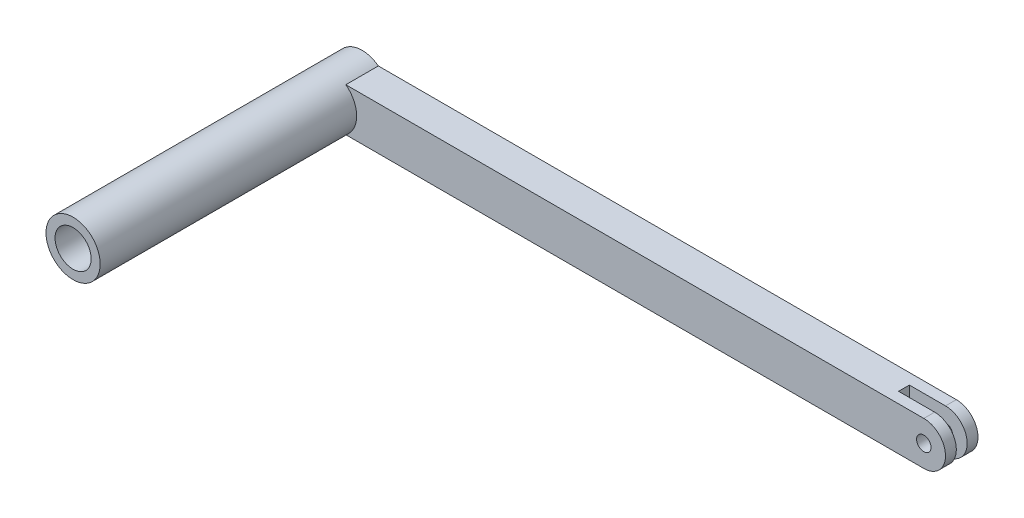
ISO-10303-21;
HEADER;
FILE_DESCRIPTION(('STEP AP214'),'2;1');
FILE_NAME('part.step','',(''),(''),'','','');
FILE_SCHEMA(('AUTOMOTIVE_DESIGN { 1 0 10303 214 1 1 1 1 }'));
ENDSEC;
DATA;
#1=APPLICATION_CONTEXT('core data for automotive mechanical design processes');
#2=APPLICATION_PROTOCOL_DEFINITION('international standard','automotive_design',2000,#1);
#3=PRODUCT_CONTEXT('',#1,'mechanical');
#4=PRODUCT('Part','Part','',(#3));
#5=PRODUCT_RELATED_PRODUCT_CATEGORY('part','',(#4));
#6=PRODUCT_DEFINITION_FORMATION('','',#4);
#7=PRODUCT_DEFINITION_CONTEXT('part definition',#1,'design');
#8=PRODUCT_DEFINITION('design','',#6,#7);
#9=PRODUCT_DEFINITION_SHAPE('','',#8);
#10=(LENGTH_UNIT() NAMED_UNIT(*) SI_UNIT(.MILLI.,.METRE.));
#11=(NAMED_UNIT(*) PLANE_ANGLE_UNIT() SI_UNIT($,.RADIAN.));
#12=(NAMED_UNIT(*) SI_UNIT($,.STERADIAN.) SOLID_ANGLE_UNIT());
#13=UNCERTAINTY_MEASURE_WITH_UNIT(LENGTH_MEASURE(1.E-05),#10,'distance_accuracy_value','');
#14=(GEOMETRIC_REPRESENTATION_CONTEXT(3) GLOBAL_UNCERTAINTY_ASSIGNED_CONTEXT((#13)) GLOBAL_UNIT_ASSIGNED_CONTEXT((#10,
#11,#12)) REPRESENTATION_CONTEXT('',''));
#15=CARTESIAN_POINT('',(0.,0.,0.));
#16=DIRECTION('',(0.,0.,1.));
#17=DIRECTION('',(1.,0.,0.));
#18=AXIS2_PLACEMENT_3D('',#15,#16,#17);
#19=CARTESIAN_POINT('',(164.5,0.,0.));
#20=DIRECTION('',(0.,0.,1.));
#21=DIRECTION('',(1.,0.,0.));
#22=AXIS2_PLACEMENT_3D('',#19,#20,#21);
#23=CYLINDRICAL_SURFACE('',#22,6.);
#24=CARTESIAN_POINT('',(164.5,0.,6.));
#25=DIRECTION('',(0.,0.,1.));
#26=DIRECTION('',(1.,0.,0.));
#27=AXIS2_PLACEMENT_3D('',#24,#25,#26);
#28=CIRCLE('',#27,6.);
#29=CARTESIAN_POINT('',(164.5,6.00000000000002,6.));
#30=VERTEX_POINT('',#29);
#31=CARTESIAN_POINT('',(164.5,-6.,6.));
#32=VERTEX_POINT('',#31);
#33=EDGE_CURVE('E145',#30,#32,#28,.F.);
#34=ORIENTED_EDGE('',*,*,#33,.F.);
#35=DIRECTION('',(0.,0.,1.));
#36=VECTOR('',#35,1.);
#37=CARTESIAN_POINT('',(164.5,6.,0.));
#38=LINE('',#37,#36);
#39=CARTESIAN_POINT('',(164.5,6.,9.));
#40=VERTEX_POINT('',#39);
#41=EDGE_CURVE('E187',#30,#40,#38,.T.);
#42=ORIENTED_EDGE('',*,*,#41,.T.);
#43=CARTESIAN_POINT('',(164.5,0.,9.));
#44=DIRECTION('',(0.,0.,1.));
#45=DIRECTION('',(-1.,0.,0.));
#46=AXIS2_PLACEMENT_3D('',#43,#44,#45);
#47=CIRCLE('',#46,6.);
#48=CARTESIAN_POINT('',(164.5,-6.,9.));
#49=VERTEX_POINT('',#48);
#50=EDGE_CURVE('E175',#49,#40,#47,.T.);
#51=ORIENTED_EDGE('',*,*,#50,.F.);
#52=DIRECTION('',(0.,0.,1.));
#53=VECTOR('',#52,1.);
#54=CARTESIAN_POINT('',(164.5,-6.,0.));
#55=LINE('',#54,#53);
#56=EDGE_CURVE('E192',#32,#49,#55,.T.);
#57=ORIENTED_EDGE('',*,*,#56,.F.);
#58=EDGE_LOOP('',(#34,#42,#51,#57));
#59=FACE_BOUND('',#58,.T.);
#60=ADVANCED_FACE('F39',(#59),#23,.T.);
#61=CARTESIAN_POINT('',(164.5,0.,0.));
#62=DIRECTION('',(0.,0.,1.));
#63=DIRECTION('',(1.,0.,0.));
#64=AXIS2_PLACEMENT_3D('',#61,#62,#63);
#65=CYLINDRICAL_SURFACE('',#64,2.);
#66=CARTESIAN_POINT('',(164.5,0.,6.));
#67=DIRECTION('',(0.,0.,1.));
#68=DIRECTION('',(1.,0.,0.));
#69=AXIS2_PLACEMENT_3D('',#66,#67,#68);
#70=CIRCLE('',#69,2.);
#71=CARTESIAN_POINT('',(166.5,0.,6.));
#72=VERTEX_POINT('',#71);
#73=EDGE_CURVE('E141',#72,#72,#70,.F.);
#74=ORIENTED_EDGE('',*,*,#73,.T.);
#75=EDGE_LOOP('',(#74));
#76=FACE_BOUND('',#75,.T.);
#77=CARTESIAN_POINT('',(164.5,0.,9.));
#78=DIRECTION('',(0.,0.,1.));
#79=DIRECTION('',(1.,0.,0.));
#80=AXIS2_PLACEMENT_3D('',#77,#78,#79);
#81=CIRCLE('',#80,2.);
#82=CARTESIAN_POINT('',(166.5,0.,9.));
#83=VERTEX_POINT('',#82);
#84=EDGE_CURVE('E148',#83,#83,#81,.T.);
#85=ORIENTED_EDGE('',*,*,#84,.T.);
#86=EDGE_LOOP('',(#85));
#87=FACE_BOUND('',#86,.T.);
#88=ADVANCED_FACE('F216',(#76,#87),#65,.F.);
#89=CARTESIAN_POINT('',(0.,0.,80.));
#90=DIRECTION('',(0.,0.,1.));
#91=DIRECTION('',(1.,0.,0.));
#92=AXIS2_PLACEMENT_3D('',#89,#90,#91);
#93=PLANE('',#92);
#94=CARTESIAN_POINT('',(0.,0.,80.));
#95=DIRECTION('',(0.,0.,1.));
#96=DIRECTION('',(1.,0.,0.));
#97=AXIS2_PLACEMENT_3D('',#94,#95,#96);
#98=CIRCLE('',#97,7.5);
#99=CARTESIAN_POINT('',(7.5,0.,80.));
#100=VERTEX_POINT('',#99);
#101=EDGE_CURVE('E48',#100,#100,#98,.T.);
#102=ORIENTED_EDGE('',*,*,#101,.T.);
#103=EDGE_LOOP('',(#102));
#104=FACE_BOUND('',#103,.T.);
#105=CARTESIAN_POINT('',(0.,0.,80.));
#106=DIRECTION('',(0.,0.,1.));
#107=DIRECTION('',(1.,0.,0.));
#108=AXIS2_PLACEMENT_3D('',#105,#106,#107);
#109=CIRCLE('',#108,5.);
#110=CARTESIAN_POINT('',(5.,0.,80.));
#111=VERTEX_POINT('',#110);
#112=EDGE_CURVE('E196',#111,#111,#109,.T.);
#113=ORIENTED_EDGE('',*,*,#112,.F.);
#114=EDGE_LOOP('',(#113));
#115=FACE_BOUND('',#114,.T.);
#116=ADVANCED_FACE('F240',(#104,#115),#93,.T.);
#117=CARTESIAN_POINT('',(0.,0.,0.));
#118=DIRECTION('',(0.,0.,1.));
#119=DIRECTION('',(1.,0.,0.));
#120=AXIS2_PLACEMENT_3D('',#117,#118,#119);
#121=PLANE('',#120);
#122=CARTESIAN_POINT('',(0.,0.,0.));
#123=DIRECTION('',(0.,0.,1.));
#124=DIRECTION('',(1.,0.,0.));
#125=AXIS2_PLACEMENT_3D('',#122,#123,#124);
#126=CIRCLE('',#125,7.5);
#127=CARTESIAN_POINT('',(4.50000000000003,6.,0.));
#128=VERTEX_POINT('',#127);
#129=CARTESIAN_POINT('',(4.50000000000003,-6.,0.));
#130=VERTEX_POINT('',#129);
#131=EDGE_CURVE('E200',#128,#130,#126,.T.);
#132=ORIENTED_EDGE('',*,*,#131,.F.);
#133=DIRECTION('',(-1.,0.,0.));
#134=VECTOR('',#133,1.);
#135=CARTESIAN_POINT('',(164.5,6.,0.));
#136=LINE('',#135,#134);
#137=CARTESIAN_POINT('',(164.5,6.,0.));
#138=VERTEX_POINT('',#137);
#139=EDGE_CURVE('E165',#138,#128,#136,.T.);
#140=ORIENTED_EDGE('',*,*,#139,.F.);
#141=CARTESIAN_POINT('',(164.5,0.,0.));
#142=DIRECTION('',(0.,0.,1.));
#143=DIRECTION('',(-1.,0.,0.));
#144=AXIS2_PLACEMENT_3D('',#141,#142,#143);
#145=CIRCLE('',#144,6.);
#146=CARTESIAN_POINT('',(164.5,-6.,0.));
#147=VERTEX_POINT('',#146);
#148=EDGE_CURVE('E161',#147,#138,#145,.T.);
#149=ORIENTED_EDGE('',*,*,#148,.F.);
#150=DIRECTION('',(1.,0.,0.));
#151=VECTOR('',#150,1.);
#152=CARTESIAN_POINT('',(164.5,-6.,0.));
#153=LINE('',#152,#151);
#154=EDGE_CURVE('E157',#130,#147,#153,.T.);
#155=ORIENTED_EDGE('',*,*,#154,.F.);
#156=EDGE_LOOP('',(#132,#140,#149,#155));
#157=FACE_BOUND('',#156,.T.);
#158=CARTESIAN_POINT('',(0.,0.,0.));
#159=DIRECTION('',(0.,0.,1.));
#160=DIRECTION('',(1.,0.,0.));
#161=AXIS2_PLACEMENT_3D('',#158,#159,#160);
#162=CIRCLE('',#161,5.);
#163=CARTESIAN_POINT('',(5.,0.,0.));
#164=VERTEX_POINT('',#163);
#165=EDGE_CURVE('E183',#164,#164,#162,.T.);
#166=ORIENTED_EDGE('',*,*,#165,.T.);
#167=EDGE_LOOP('',(#166));
#168=FACE_BOUND('',#167,.T.);
#169=CARTESIAN_POINT('',(164.5,0.,0.));
#170=DIRECTION('',(0.,0.,1.));
#171=DIRECTION('',(1.,0.,0.));
#172=AXIS2_PLACEMENT_3D('',#169,#170,#171);
#173=CIRCLE('',#172,2.);
#174=CARTESIAN_POINT('',(166.5,0.,0.));
#175=VERTEX_POINT('',#174);
#176=EDGE_CURVE('E149',#175,#175,#173,.T.);
#177=ORIENTED_EDGE('',*,*,#176,.T.);
#178=EDGE_LOOP('',(#177));
#179=FACE_BOUND('',#178,.T.);
#180=ADVANCED_FACE('F258',(#157,#168,#179),#121,.F.);
#181=CARTESIAN_POINT('',(0.,0.,80.));
#182=DIRECTION('',(0.,0.,-1.));
#183=DIRECTION('',(-1.,0.,0.));
#184=AXIS2_PLACEMENT_3D('',#181,#182,#183);
#185=CYLINDRICAL_SURFACE('',#184,7.5);
#186=ORIENTED_EDGE('',*,*,#101,.F.);
#187=EDGE_LOOP('',(#186));
#188=FACE_BOUND('',#187,.T.);
#189=CARTESIAN_POINT('',(0.,0.,9.));
#190=DIRECTION('',(0.,0.,-1.));
#191=DIRECTION('',(1.,0.,0.));
#192=AXIS2_PLACEMENT_3D('',#189,#190,#191);
#193=CIRCLE('',#192,7.50000000000002);
#194=CARTESIAN_POINT('',(4.50000000000002,5.99999999999999,8.99999999999999));
#195=VERTEX_POINT('',#194);
#196=CARTESIAN_POINT('',(4.50000000000003,-6.,9.));
#197=VERTEX_POINT('',#196);
#198=EDGE_CURVE('E153',#195,#197,#193,.T.);
#199=ORIENTED_EDGE('',*,*,#198,.F.);
#200=DIRECTION('',(0.,0.,1.));
#201=VECTOR('',#200,1.);
#202=CARTESIAN_POINT('',(4.50000000000003,6.,0.));
#203=LINE('',#202,#201);
#204=EDGE_CURVE('E180',#128,#195,#203,.T.);
#205=ORIENTED_EDGE('',*,*,#204,.F.);
#206=ORIENTED_EDGE('',*,*,#131,.T.);
#207=DIRECTION('',(0.,0.,1.));
#208=VECTOR('',#207,1.);
#209=CARTESIAN_POINT('',(4.50000000000003,-6.,0.));
#210=LINE('',#209,#208);
#211=EDGE_CURVE('E168',#130,#197,#210,.T.);
#212=ORIENTED_EDGE('',*,*,#211,.T.);
#213=EDGE_LOOP('',(#199,#205,#206,#212));
#214=FACE_BOUND('',#213,.T.);
#215=ADVANCED_FACE('F41',(#188,#214),#185,.T.);
#216=CARTESIAN_POINT('',(0.,0.,80.));
#217=DIRECTION('',(0.,0.,-1.));
#218=DIRECTION('',(-1.,0.,0.));
#219=AXIS2_PLACEMENT_3D('',#216,#217,#218);
#220=CYLINDRICAL_SURFACE('',#219,5.);
#221=ORIENTED_EDGE('',*,*,#112,.T.);
#222=EDGE_LOOP('',(#221));
#223=FACE_BOUND('',#222,.T.);
#224=ORIENTED_EDGE('',*,*,#165,.F.);
#225=EDGE_LOOP('',(#224));
#226=FACE_BOUND('',#225,.T.);
#227=ADVANCED_FACE('F252',(#223,#226),#220,.F.);
#228=CARTESIAN_POINT('',(164.5,6.,0.));
#229=DIRECTION('',(0.,1.,0.));
#230=DIRECTION('',(-1.,0.,0.));
#231=AXIS2_PLACEMENT_3D('',#228,#229,#230);
#232=PLANE('',#231);
#233=DIRECTION('',(1.,0.,0.));
#234=VECTOR('',#233,1.);
#235=CARTESIAN_POINT('',(154.5,6.00000000000002,6.));
#236=LINE('',#235,#234);
#237=CARTESIAN_POINT('',(154.5,6.00000000000002,6.));
#238=VERTEX_POINT('',#237);
#239=EDGE_CURVE('E114',#238,#30,#236,.T.);
#240=ORIENTED_EDGE('',*,*,#239,.F.);
#241=DIRECTION('',(0.,0.,1.));
#242=VECTOR('',#241,1.);
#243=CARTESIAN_POINT('',(154.5,6.00000000000002,3.));
#244=LINE('',#243,#242);
#245=CARTESIAN_POINT('',(154.5,6.00000000000002,3.));
#246=VERTEX_POINT('',#245);
#247=EDGE_CURVE('E108',#246,#238,#244,.T.);
#248=ORIENTED_EDGE('',*,*,#247,.F.);
#249=DIRECTION('',(-1.,0.,0.));
#250=VECTOR('',#249,1.);
#251=CARTESIAN_POINT('',(154.5,6.00000000000002,3.));
#252=LINE('',#251,#250);
#253=CARTESIAN_POINT('',(164.5,6.00000000000002,3.));
#254=VERTEX_POINT('',#253);
#255=EDGE_CURVE('E117',#254,#246,#252,.T.);
#256=ORIENTED_EDGE('',*,*,#255,.F.);
#257=EDGE_CURVE('E184',#138,#254,#38,.T.);
#258=ORIENTED_EDGE('',*,*,#257,.F.);
#259=ORIENTED_EDGE('',*,*,#139,.T.);
#260=ORIENTED_EDGE('',*,*,#204,.T.);
#261=DIRECTION('',(-1.,0.,0.));
#262=VECTOR('',#261,1.);
#263=CARTESIAN_POINT('',(164.5,6.,9.));
#264=LINE('',#263,#262);
#265=EDGE_CURVE('E62',#40,#195,#264,.T.);
#266=ORIENTED_EDGE('',*,*,#265,.F.);
#267=ORIENTED_EDGE('',*,*,#41,.F.);
#268=EDGE_LOOP('',(#240,#248,#256,#258,#259,#260,#266,#267));
#269=FACE_BOUND('',#268,.T.);
#270=ADVANCED_FACE('F126',(#269),#232,.T.);
#271=CARTESIAN_POINT('',(164.5,0.,3.));
#272=DIRECTION('',(0.,0.,-1.));
#273=DIRECTION('',(-1.,0.,0.));
#274=AXIS2_PLACEMENT_3D('',#271,#272,#273);
#275=CIRCLE('',#274,6.);
#276=CARTESIAN_POINT('',(164.5,-6.,3.));
#277=VERTEX_POINT('',#276);
#278=EDGE_CURVE('E121',#277,#254,#275,.F.);
#279=ORIENTED_EDGE('',*,*,#278,.F.);
#280=EDGE_CURVE('E188',#147,#277,#55,.T.);
#281=ORIENTED_EDGE('',*,*,#280,.F.);
#282=ORIENTED_EDGE('',*,*,#148,.T.);
#283=ORIENTED_EDGE('',*,*,#257,.T.);
#284=EDGE_LOOP('',(#279,#281,#282,#283));
#285=FACE_BOUND('',#284,.T.);
#286=ADVANCED_FACE('F236',(#285),#23,.T.);
#287=CARTESIAN_POINT('',(164.5,-6.,0.));
#288=DIRECTION('',(0.,-1.,0.));
#289=DIRECTION('',(1.,0.,0.));
#290=AXIS2_PLACEMENT_3D('',#287,#288,#289);
#291=PLANE('',#290);
#292=DIRECTION('',(-1.,0.,0.));
#293=VECTOR('',#292,1.);
#294=CARTESIAN_POINT('',(164.5,-6.,6.));
#295=LINE('',#294,#293);
#296=CARTESIAN_POINT('',(154.5,-6.,6.));
#297=VERTEX_POINT('',#296);
#298=EDGE_CURVE('E142',#32,#297,#295,.T.);
#299=ORIENTED_EDGE('',*,*,#298,.F.);
#300=ORIENTED_EDGE('',*,*,#56,.T.);
#301=DIRECTION('',(1.,0.,0.));
#302=VECTOR('',#301,1.);
#303=CARTESIAN_POINT('',(164.5,-6.,9.));
#304=LINE('',#303,#302);
#305=EDGE_CURVE('E171',#197,#49,#304,.T.);
#306=ORIENTED_EDGE('',*,*,#305,.F.);
#307=ORIENTED_EDGE('',*,*,#211,.F.);
#308=ORIENTED_EDGE('',*,*,#154,.T.);
#309=ORIENTED_EDGE('',*,*,#280,.T.);
#310=DIRECTION('',(1.,0.,0.));
#311=VECTOR('',#310,1.);
#312=CARTESIAN_POINT('',(164.5,-6.,3.));
#313=LINE('',#312,#311);
#314=CARTESIAN_POINT('',(154.5,-6.,3.));
#315=VERTEX_POINT('',#314);
#316=EDGE_CURVE('E136',#315,#277,#313,.T.);
#317=ORIENTED_EDGE('',*,*,#316,.F.);
#318=DIRECTION('',(0.,0.,-1.));
#319=VECTOR('',#318,1.);
#320=CARTESIAN_POINT('',(154.5,-6.,0.));
#321=LINE('',#320,#319);
#322=EDGE_CURVE('E11',#297,#315,#321,.T.);
#323=ORIENTED_EDGE('',*,*,#322,.F.);
#324=EDGE_LOOP('',(#299,#300,#306,#307,#308,#309,#317,#323));
#325=FACE_BOUND('',#324,.T.);
#326=ADVANCED_FACE('F245',(#325),#291,.T.);
#327=CARTESIAN_POINT('',(0.,0.,9.));
#328=DIRECTION('',(0.,0.,1.));
#329=DIRECTION('',(1.,0.,0.));
#330=AXIS2_PLACEMENT_3D('',#327,#328,#329);
#331=PLANE('',#330);
#332=ORIENTED_EDGE('',*,*,#84,.F.);
#333=EDGE_LOOP('',(#332));
#334=FACE_BOUND('',#333,.T.);
#335=ORIENTED_EDGE('',*,*,#198,.T.);
#336=ORIENTED_EDGE('',*,*,#305,.T.);
#337=ORIENTED_EDGE('',*,*,#50,.T.);
#338=ORIENTED_EDGE('',*,*,#265,.T.);
#339=EDGE_LOOP('',(#335,#336,#337,#338));
#340=FACE_BOUND('',#339,.T.);
#341=ADVANCED_FACE('F229',(#334,#340),#331,.T.);
#342=CARTESIAN_POINT('',(164.5,0.,3.));
#343=DIRECTION('',(0.,0.,-1.));
#344=DIRECTION('',(-1.,0.,0.));
#345=AXIS2_PLACEMENT_3D('',#342,#343,#344);
#346=CIRCLE('',#345,2.);
#347=CARTESIAN_POINT('',(162.5,0.,3.));
#348=VERTEX_POINT('',#347);
#349=EDGE_CURVE('E134',#348,#348,#346,.F.);
#350=ORIENTED_EDGE('',*,*,#349,.T.);
#351=EDGE_LOOP('',(#350));
#352=FACE_BOUND('',#351,.T.);
#353=ORIENTED_EDGE('',*,*,#176,.F.);
#354=EDGE_LOOP('',(#353));
#355=FACE_BOUND('',#354,.T.);
#356=ADVANCED_FACE('F221',(#352,#355),#65,.F.);
#357=CARTESIAN_POINT('',(154.5,-14.,6.));
#358=DIRECTION('',(0.,0.,1.));
#359=DIRECTION('',(1.,0.,0.));
#360=AXIS2_PLACEMENT_3D('',#357,#358,#359);
#361=PLANE('',#360);
#362=ORIENTED_EDGE('',*,*,#33,.T.);
#363=ORIENTED_EDGE('',*,*,#298,.T.);
#364=DIRECTION('',(0.,1.,0.));
#365=VECTOR('',#364,1.);
#366=CARTESIAN_POINT('',(154.5,-14.,6.));
#367=LINE('',#366,#365);
#368=EDGE_CURVE('E113',#297,#238,#367,.T.);
#369=ORIENTED_EDGE('',*,*,#368,.T.);
#370=ORIENTED_EDGE('',*,*,#239,.T.);
#371=EDGE_LOOP('',(#362,#363,#369,#370));
#372=FACE_BOUND('',#371,.T.);
#373=ORIENTED_EDGE('',*,*,#73,.F.);
#374=EDGE_LOOP('',(#373));
#375=FACE_BOUND('',#374,.T.);
#376=ADVANCED_FACE('F219',(#372,#375),#361,.F.);
#377=CARTESIAN_POINT('',(154.5,-14.,3.));
#378=DIRECTION('',(0.,0.,-1.));
#379=DIRECTION('',(-1.,0.,0.));
#380=AXIS2_PLACEMENT_3D('',#377,#378,#379);
#381=PLANE('',#380);
#382=ORIENTED_EDGE('',*,*,#278,.T.);
#383=ORIENTED_EDGE('',*,*,#255,.T.);
#384=DIRECTION('',(0.,1.,0.));
#385=VECTOR('',#384,1.);
#386=CARTESIAN_POINT('',(154.5,-14.,3.));
#387=LINE('',#386,#385);
#388=EDGE_CURVE('E55',#315,#246,#387,.T.);
#389=ORIENTED_EDGE('',*,*,#388,.F.);
#390=ORIENTED_EDGE('',*,*,#316,.T.);
#391=EDGE_LOOP('',(#382,#383,#389,#390));
#392=FACE_BOUND('',#391,.T.);
#393=ORIENTED_EDGE('',*,*,#349,.F.);
#394=EDGE_LOOP('',(#393));
#395=FACE_BOUND('',#394,.T.);
#396=ADVANCED_FACE('F118',(#392,#395),#381,.F.);
#397=CARTESIAN_POINT('',(154.5,-14.,3.));
#398=DIRECTION('',(-1.,0.,0.));
#399=DIRECTION('',(0.,-1.,0.));
#400=AXIS2_PLACEMENT_3D('',#397,#398,#399);
#401=PLANE('',#400);
#402=ORIENTED_EDGE('',*,*,#322,.T.);
#403=ORIENTED_EDGE('',*,*,#388,.T.);
#404=ORIENTED_EDGE('',*,*,#247,.T.);
#405=ORIENTED_EDGE('',*,*,#368,.F.);
#406=EDGE_LOOP('',(#402,#403,#404,#405));
#407=FACE_BOUND('',#406,.T.);
#408=ADVANCED_FACE('F105',(#407),#401,.F.);
#409=CLOSED_SHELL('',(#60,#88,#116,#180,#215,#227,#270,#286,#326,#341,#356,#376,#396,#408));
#410=MANIFOLD_SOLID_BREP('B2',#409);
#411=ADVANCED_BREP_SHAPE_REPRESENTATION('',(#18,#410),#14);
#412=SHAPE_DEFINITION_REPRESENTATION(#9,#411);
ENDSEC;
END-ISO-10303-21;
